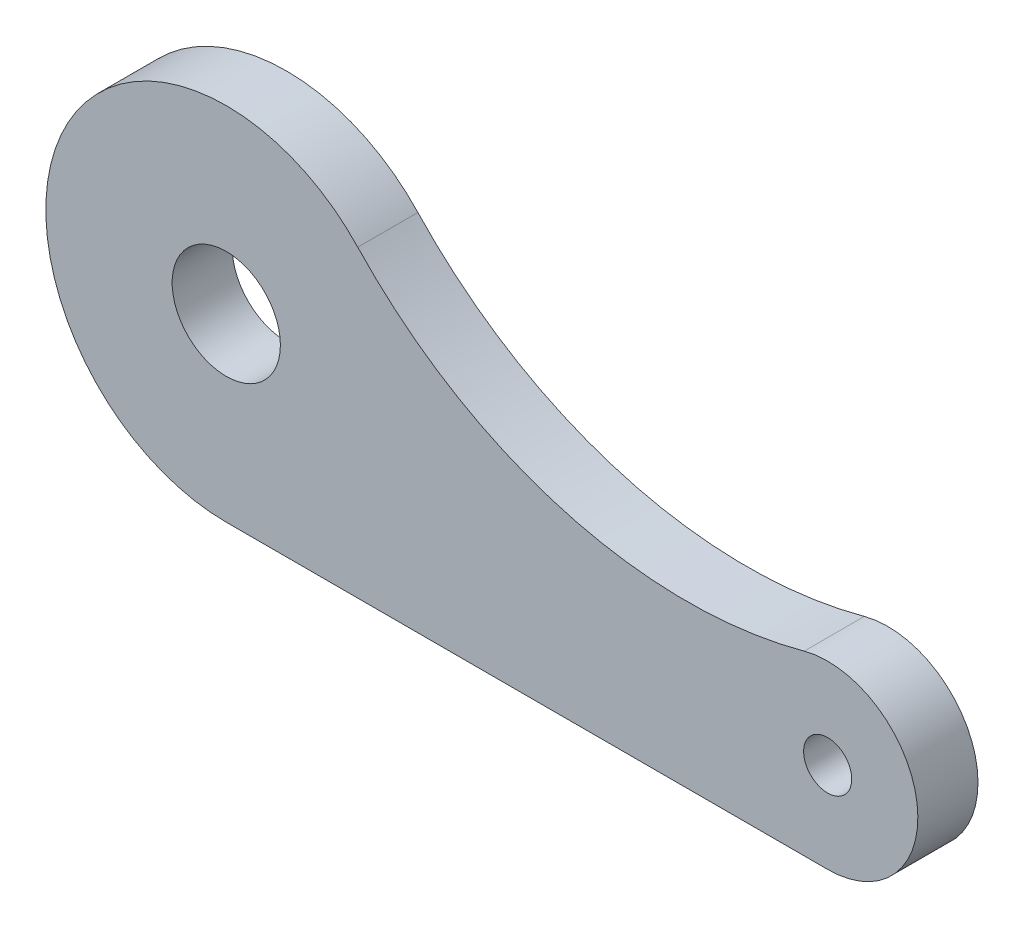
ISO-10303-21;
HEADER;
FILE_DESCRIPTION(('STEP AP214'),'2;1');
FILE_NAME('part.step','',(''),(''),'','','');
FILE_SCHEMA(('AUTOMOTIVE_DESIGN { 1 0 10303 214 1 1 1 1 }'));
ENDSEC;
DATA;
#1=APPLICATION_CONTEXT('core data for automotive mechanical design processes');
#2=APPLICATION_PROTOCOL_DEFINITION('international standard','automotive_design',2000,#1);
#3=PRODUCT_CONTEXT('',#1,'mechanical');
#4=PRODUCT('Part','Part','',(#3));
#5=PRODUCT_RELATED_PRODUCT_CATEGORY('part','',(#4));
#6=PRODUCT_DEFINITION_FORMATION('','',#4);
#7=PRODUCT_DEFINITION_CONTEXT('part definition',#1,'design');
#8=PRODUCT_DEFINITION('design','',#6,#7);
#9=PRODUCT_DEFINITION_SHAPE('','',#8);
#10=(LENGTH_UNIT() NAMED_UNIT(*) SI_UNIT(.MILLI.,.METRE.));
#11=(NAMED_UNIT(*) PLANE_ANGLE_UNIT() SI_UNIT($,.RADIAN.));
#12=(NAMED_UNIT(*) SI_UNIT($,.STERADIAN.) SOLID_ANGLE_UNIT());
#13=UNCERTAINTY_MEASURE_WITH_UNIT(LENGTH_MEASURE(1.E-05),#10,'distance_accuracy_value','');
#14=(GEOMETRIC_REPRESENTATION_CONTEXT(3) GLOBAL_UNCERTAINTY_ASSIGNED_CONTEXT((#13)) GLOBAL_UNIT_ASSIGNED_CONTEXT((#10,
#11,#12)) REPRESENTATION_CONTEXT('',''));
#15=CARTESIAN_POINT('',(0.,0.,0.));
#16=DIRECTION('',(0.,0.,1.));
#17=DIRECTION('',(1.,0.,0.));
#18=AXIS2_PLACEMENT_3D('',#15,#16,#17);
#19=CARTESIAN_POINT('',(0.,0.,5.));
#20=DIRECTION('',(0.,0.,1.));
#21=DIRECTION('',(1.,0.,0.));
#22=AXIS2_PLACEMENT_3D('',#19,#20,#21);
#23=PLANE('',#22);
#24=CARTESIAN_POINT('',(0.,0.,5.));
#25=DIRECTION('',(0.,0.,1.));
#26=DIRECTION('',(1.,0.,0.));
#27=AXIS2_PLACEMENT_3D('',#24,#25,#26);
#28=CIRCLE('',#27,4.5);
#29=CARTESIAN_POINT('',(4.5,0.,5.));
#30=VERTEX_POINT('',#29);
#31=EDGE_CURVE('E99',#30,#30,#28,.T.);
#32=ORIENTED_EDGE('',*,*,#31,.F.);
#33=EDGE_LOOP('',(#32));
#34=FACE_BOUND('',#33,.T.);
#35=CARTESIAN_POINT('',(0.,0.,5.));
#36=DIRECTION('',(0.,0.,1.));
#37=DIRECTION('',(1.,0.,0.));
#38=AXIS2_PLACEMENT_3D('',#35,#36,#37);
#39=CIRCLE('',#38,15.);
#40=CARTESIAN_POINT('',(10.9332866224799,10.2695298641516,5.));
#41=VERTEX_POINT('',#40);
#42=CARTESIAN_POINT('',(0.,-15.,5.));
#43=VERTEX_POINT('',#42);
#44=EDGE_CURVE('E84',#41,#43,#39,.T.);
#45=ORIENTED_EDGE('',*,*,#44,.T.);
#46=DIRECTION('',(1.,0.,0.));
#47=VECTOR('',#46,1.);
#48=CARTESIAN_POINT('',(0.,-15.,5.));
#49=LINE('',#48,#47);
#50=CARTESIAN_POINT('',(50.,-15.,5.));
#51=VERTEX_POINT('',#50);
#52=EDGE_CURVE('E79',#43,#51,#49,.T.);
#53=ORIENTED_EDGE('',*,*,#52,.T.);
#54=CARTESIAN_POINT('',(50.,-7.5,5.));
#55=DIRECTION('',(0.,0.,1.));
#56=DIRECTION('',(1.,0.,0.));
#57=AXIS2_PLACEMENT_3D('',#54,#55,#56);
#58=CIRCLE('',#57,7.5);
#59=CARTESIAN_POINT('',(48.0444171964466,-0.259440912578211,5.));
#60=VERTEX_POINT('',#59);
#61=EDGE_CURVE('E82',#51,#60,#58,.T.);
#62=ORIENTED_EDGE('',*,*,#61,.T.);
#63=CARTESIAN_POINT('',(38.2665031786796,35.9433545245307,5.));
#64=DIRECTION('',(0.,0.,-1.));
#65=DIRECTION('',(1.,0.,0.));
#66=AXIS2_PLACEMENT_3D('',#63,#64,#65);
#67=CIRCLE('',#66,37.5);
#68=EDGE_CURVE('E49',#60,#41,#67,.T.);
#69=ORIENTED_EDGE('',*,*,#68,.T.);
#70=EDGE_LOOP('',(#45,#53,#62,#69));
#71=FACE_BOUND('',#70,.T.);
#72=CARTESIAN_POINT('',(50.,-7.5,5.));
#73=DIRECTION('',(0.,0.,1.));
#74=DIRECTION('',(1.,0.,0.));
#75=AXIS2_PLACEMENT_3D('',#72,#73,#74);
#76=CIRCLE('',#75,2.);
#77=CARTESIAN_POINT('',(52.,-7.5,5.));
#78=VERTEX_POINT('',#77);
#79=EDGE_CURVE('E114',#78,#78,#76,.T.);
#80=ORIENTED_EDGE('',*,*,#79,.F.);
#81=EDGE_LOOP('',(#80));
#82=FACE_BOUND('',#81,.T.);
#83=ADVANCED_FACE('F32',(#34,#71,#82),#23,.T.);
#84=CARTESIAN_POINT('',(0.,0.,0.));
#85=DIRECTION('',(0.,0.,1.));
#86=DIRECTION('',(1.,0.,0.));
#87=AXIS2_PLACEMENT_3D('',#84,#85,#86);
#88=PLANE('',#87);
#89=CARTESIAN_POINT('',(0.,0.,0.));
#90=DIRECTION('',(0.,0.,1.));
#91=DIRECTION('',(1.,0.,0.));
#92=AXIS2_PLACEMENT_3D('',#89,#90,#91);
#93=CIRCLE('',#92,4.5);
#94=CARTESIAN_POINT('',(4.5,0.,0.));
#95=VERTEX_POINT('',#94);
#96=EDGE_CURVE('E111',#95,#95,#93,.T.);
#97=ORIENTED_EDGE('',*,*,#96,.T.);
#98=EDGE_LOOP('',(#97));
#99=FACE_BOUND('',#98,.T.);
#100=CARTESIAN_POINT('',(0.,0.,0.));
#101=DIRECTION('',(0.,0.,1.));
#102=DIRECTION('',(1.,0.,0.));
#103=AXIS2_PLACEMENT_3D('',#100,#101,#102);
#104=CIRCLE('',#103,15.);
#105=CARTESIAN_POINT('',(10.9332866224799,10.2695298641516,0.));
#106=VERTEX_POINT('',#105);
#107=CARTESIAN_POINT('',(0.,-15.,0.));
#108=VERTEX_POINT('',#107);
#109=EDGE_CURVE('E96',#106,#108,#104,.T.);
#110=ORIENTED_EDGE('',*,*,#109,.F.);
#111=CARTESIAN_POINT('',(38.2665031786796,35.9433545245307,0.));
#112=DIRECTION('',(0.,0.,-1.));
#113=DIRECTION('',(1.,0.,0.));
#114=AXIS2_PLACEMENT_3D('',#111,#112,#113);
#115=CIRCLE('',#114,37.5);
#116=CARTESIAN_POINT('',(48.0444171964466,-0.259440912578211,0.));
#117=VERTEX_POINT('',#116);
#118=EDGE_CURVE('E72',#117,#106,#115,.T.);
#119=ORIENTED_EDGE('',*,*,#118,.F.);
#120=CARTESIAN_POINT('',(50.,-7.5,0.));
#121=DIRECTION('',(0.,0.,1.));
#122=DIRECTION('',(1.,0.,0.));
#123=AXIS2_PLACEMENT_3D('',#120,#121,#122);
#124=CIRCLE('',#123,7.5);
#125=CARTESIAN_POINT('',(50.,-15.,0.));
#126=VERTEX_POINT('',#125);
#127=EDGE_CURVE('E66',#126,#117,#124,.T.);
#128=ORIENTED_EDGE('',*,*,#127,.F.);
#129=DIRECTION('',(1.,0.,0.));
#130=VECTOR('',#129,1.);
#131=CARTESIAN_POINT('',(0.,-15.,0.));
#132=LINE('',#131,#130);
#133=EDGE_CURVE('E88',#108,#126,#132,.T.);
#134=ORIENTED_EDGE('',*,*,#133,.F.);
#135=EDGE_LOOP('',(#110,#119,#128,#134));
#136=FACE_BOUND('',#135,.T.);
#137=CARTESIAN_POINT('',(50.,-7.5,0.));
#138=DIRECTION('',(0.,0.,1.));
#139=DIRECTION('',(1.,0.,0.));
#140=AXIS2_PLACEMENT_3D('',#137,#138,#139);
#141=CIRCLE('',#140,2.);
#142=CARTESIAN_POINT('',(52.,-7.5,0.));
#143=VERTEX_POINT('',#142);
#144=EDGE_CURVE('E117',#143,#143,#141,.T.);
#145=ORIENTED_EDGE('',*,*,#144,.T.);
#146=EDGE_LOOP('',(#145));
#147=FACE_BOUND('',#146,.T.);
#148=ADVANCED_FACE('F107',(#99,#136,#147),#88,.F.);
#149=CARTESIAN_POINT('',(0.,0.,5.));
#150=DIRECTION('',(0.,0.,-1.));
#151=DIRECTION('',(-1.,0.,0.));
#152=AXIS2_PLACEMENT_3D('',#149,#150,#151);
#153=CYLINDRICAL_SURFACE('',#152,15.);
#154=ORIENTED_EDGE('',*,*,#109,.T.);
#155=DIRECTION('',(0.,0.,-1.));
#156=VECTOR('',#155,1.);
#157=CARTESIAN_POINT('',(0.,-15.,5.));
#158=LINE('',#157,#156);
#159=EDGE_CURVE('E11',#43,#108,#158,.T.);
#160=ORIENTED_EDGE('',*,*,#159,.F.);
#161=ORIENTED_EDGE('',*,*,#44,.F.);
#162=DIRECTION('',(0.,0.,-1.));
#163=VECTOR('',#162,1.);
#164=CARTESIAN_POINT('',(10.9332866224799,10.2695298641516,5.));
#165=LINE('',#164,#163);
#166=EDGE_CURVE('E92',#41,#106,#165,.T.);
#167=ORIENTED_EDGE('',*,*,#166,.T.);
#168=EDGE_LOOP('',(#154,#160,#161,#167));
#169=FACE_BOUND('',#168,.T.);
#170=ADVANCED_FACE('F34',(#169),#153,.T.);
#171=CARTESIAN_POINT('',(0.,-15.,5.));
#172=DIRECTION('',(0.,1.,0.));
#173=DIRECTION('',(0.,0.,1.));
#174=AXIS2_PLACEMENT_3D('',#171,#172,#173);
#175=PLANE('',#174);
#176=ORIENTED_EDGE('',*,*,#133,.T.);
#177=DIRECTION('',(0.,0.,-1.));
#178=VECTOR('',#177,1.);
#179=CARTESIAN_POINT('',(50.,-15.,5.));
#180=LINE('',#179,#178);
#181=EDGE_CURVE('E41',#51,#126,#180,.T.);
#182=ORIENTED_EDGE('',*,*,#181,.F.);
#183=ORIENTED_EDGE('',*,*,#52,.F.);
#184=ORIENTED_EDGE('',*,*,#159,.T.);
#185=EDGE_LOOP('',(#176,#182,#183,#184));
#186=FACE_BOUND('',#185,.T.);
#187=ADVANCED_FACE('F87',(#186),#175,.F.);
#188=CARTESIAN_POINT('',(50.,-7.5,5.));
#189=DIRECTION('',(0.,0.,-1.));
#190=DIRECTION('',(-1.,0.,0.));
#191=AXIS2_PLACEMENT_3D('',#188,#189,#190);
#192=CYLINDRICAL_SURFACE('',#191,7.5);
#193=ORIENTED_EDGE('',*,*,#127,.T.);
#194=DIRECTION('',(0.,0.,-1.));
#195=VECTOR('',#194,1.);
#196=CARTESIAN_POINT('',(48.0444171964466,-0.259440912578211,5.));
#197=LINE('',#196,#195);
#198=EDGE_CURVE('E89',#60,#117,#197,.T.);
#199=ORIENTED_EDGE('',*,*,#198,.F.);
#200=ORIENTED_EDGE('',*,*,#61,.F.);
#201=ORIENTED_EDGE('',*,*,#181,.T.);
#202=EDGE_LOOP('',(#193,#199,#200,#201));
#203=FACE_BOUND('',#202,.T.);
#204=ADVANCED_FACE('F90',(#203),#192,.T.);
#205=CARTESIAN_POINT('',(38.2665031786796,35.9433545245307,5.));
#206=DIRECTION('',(0.,0.,-1.));
#207=DIRECTION('',(-1.,0.,0.));
#208=AXIS2_PLACEMENT_3D('',#205,#206,#207);
#209=CYLINDRICAL_SURFACE('',#208,37.5);
#210=ORIENTED_EDGE('',*,*,#118,.T.);
#211=ORIENTED_EDGE('',*,*,#166,.F.);
#212=ORIENTED_EDGE('',*,*,#68,.F.);
#213=ORIENTED_EDGE('',*,*,#198,.T.);
#214=EDGE_LOOP('',(#210,#211,#212,#213));
#215=FACE_BOUND('',#214,.T.);
#216=ADVANCED_FACE('F104',(#215),#209,.F.);
#217=CARTESIAN_POINT('',(0.,0.,5.));
#218=DIRECTION('',(0.,0.,-1.));
#219=DIRECTION('',(-1.,0.,0.));
#220=AXIS2_PLACEMENT_3D('',#217,#218,#219);
#221=CYLINDRICAL_SURFACE('',#220,4.5);
#222=ORIENTED_EDGE('',*,*,#31,.T.);
#223=EDGE_LOOP('',(#222));
#224=FACE_BOUND('',#223,.T.);
#225=ORIENTED_EDGE('',*,*,#96,.F.);
#226=EDGE_LOOP('',(#225));
#227=FACE_BOUND('',#226,.T.);
#228=ADVANCED_FACE('F135',(#224,#227),#221,.F.);
#229=CARTESIAN_POINT('',(50.,-7.5,5.));
#230=DIRECTION('',(0.,0.,-1.));
#231=DIRECTION('',(-1.,0.,0.));
#232=AXIS2_PLACEMENT_3D('',#229,#230,#231);
#233=CYLINDRICAL_SURFACE('',#232,2.);
#234=ORIENTED_EDGE('',*,*,#79,.T.);
#235=EDGE_LOOP('',(#234));
#236=FACE_BOUND('',#235,.T.);
#237=ORIENTED_EDGE('',*,*,#144,.F.);
#238=EDGE_LOOP('',(#237));
#239=FACE_BOUND('',#238,.T.);
#240=ADVANCED_FACE('F123',(#236,#239),#233,.F.);
#241=CLOSED_SHELL('',(#83,#148,#170,#187,#204,#216,#228,#240));
#242=MANIFOLD_SOLID_BREP('B2',#241);
#243=ADVANCED_BREP_SHAPE_REPRESENTATION('',(#18,#242),#14);
#244=SHAPE_DEFINITION_REPRESENTATION(#9,#243);
ENDSEC;
END-ISO-10303-21;
